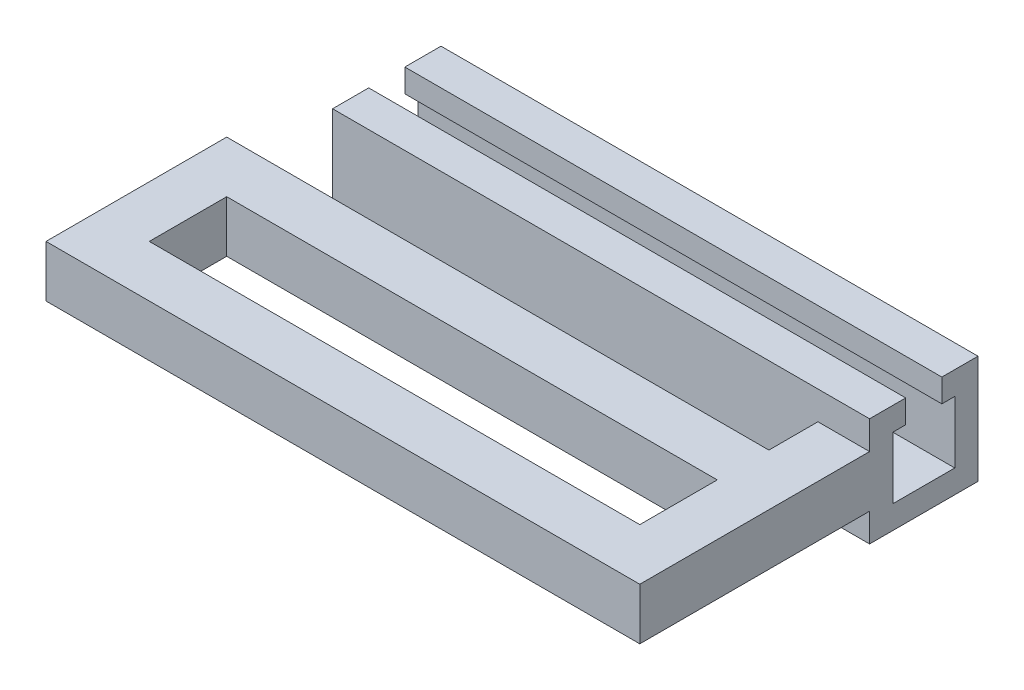
ISO-10303-21;
HEADER;
FILE_DESCRIPTION(('STEP AP214'),'2;1');
FILE_NAME('part.step','',(''),(''),'','','');
FILE_SCHEMA(('AUTOMOTIVE_DESIGN { 1 0 10303 214 1 1 1 1 }'));
ENDSEC;
DATA;
#1=APPLICATION_CONTEXT('core data for automotive mechanical design processes');
#2=APPLICATION_PROTOCOL_DEFINITION('international standard','automotive_design',2000,#1);
#3=PRODUCT_CONTEXT('',#1,'mechanical');
#4=PRODUCT('Part','Part','',(#3));
#5=PRODUCT_RELATED_PRODUCT_CATEGORY('part','',(#4));
#6=PRODUCT_DEFINITION_FORMATION('','',#4);
#7=PRODUCT_DEFINITION_CONTEXT('part definition',#1,'design');
#8=PRODUCT_DEFINITION('design','',#6,#7);
#9=PRODUCT_DEFINITION_SHAPE('','',#8);
#10=(LENGTH_UNIT() NAMED_UNIT(*) SI_UNIT(.MILLI.,.METRE.));
#11=(NAMED_UNIT(*) PLANE_ANGLE_UNIT() SI_UNIT($,.RADIAN.));
#12=(NAMED_UNIT(*) SI_UNIT($,.STERADIAN.) SOLID_ANGLE_UNIT());
#13=UNCERTAINTY_MEASURE_WITH_UNIT(LENGTH_MEASURE(1.E-05),#10,'distance_accuracy_value','');
#14=(GEOMETRIC_REPRESENTATION_CONTEXT(3) GLOBAL_UNCERTAINTY_ASSIGNED_CONTEXT((#13)) GLOBAL_UNIT_ASSIGNED_CONTEXT((#10,
#11,#12)) REPRESENTATION_CONTEXT('',''));
#15=CARTESIAN_POINT('',(0.,0.,0.));
#16=DIRECTION('',(0.,0.,1.));
#17=DIRECTION('',(1.,0.,0.));
#18=AXIS2_PLACEMENT_3D('',#15,#16,#17);
#19=CARTESIAN_POINT('',(12.5205254515599,3.1,-12.475));
#20=DIRECTION('',(0.,1.,0.));
#21=DIRECTION('',(0.,0.,1.));
#22=AXIS2_PLACEMENT_3D('',#19,#20,#21);
#23=PLANE('',#22);
#24=DIRECTION('',(-1.,0.,0.));
#25=VECTOR('',#24,1.);
#26=CARTESIAN_POINT('',(12.5205254515599,3.1,-11.075));
#27=LINE('',#26,#25);
#28=CARTESIAN_POINT('',(12.5205254515599,3.1,-11.075));
#29=VERTEX_POINT('',#28);
#30=CARTESIAN_POINT('',(-8.27947454844007,3.1,-11.075));
#31=VERTEX_POINT('',#30);
#32=EDGE_CURVE('E200',#29,#31,#27,.T.);
#33=ORIENTED_EDGE('',*,*,#32,.F.);
#34=DIRECTION('',(0.,0.,-1.));
#35=VECTOR('',#34,1.);
#36=CARTESIAN_POINT('',(12.5205254515599,3.1,-12.475));
#37=LINE('',#36,#35);
#38=CARTESIAN_POINT('',(12.5205254515599,3.1,-12.475));
#39=VERTEX_POINT('',#38);
#40=EDGE_CURVE('E259',#29,#39,#37,.T.);
#41=ORIENTED_EDGE('',*,*,#40,.T.);
#42=DIRECTION('',(-1.,0.,0.));
#43=VECTOR('',#42,1.);
#44=CARTESIAN_POINT('',(12.5205254515599,3.1,-12.475));
#45=LINE('',#44,#43);
#46=CARTESIAN_POINT('',(-8.27947454844007,3.1,-12.475));
#47=VERTEX_POINT('',#46);
#48=EDGE_CURVE('E277',#39,#47,#45,.T.);
#49=ORIENTED_EDGE('',*,*,#48,.T.);
#50=DIRECTION('',(0.,0.,-1.));
#51=VECTOR('',#50,1.);
#52=CARTESIAN_POINT('',(-8.27947454844007,3.1,-12.475));
#53=LINE('',#52,#51);
#54=EDGE_CURVE('E247',#31,#47,#53,.T.);
#55=ORIENTED_EDGE('',*,*,#54,.F.);
#56=EDGE_LOOP('',(#33,#41,#49,#55));
#57=FACE_BOUND('',#56,.T.);
#58=ADVANCED_FACE('F33',(#57),#23,.T.);
#59=CARTESIAN_POINT('',(0.,2.,0.));
#60=DIRECTION('',(0.,1.,0.));
#61=DIRECTION('',(0.,0.,1.));
#62=AXIS2_PLACEMENT_3D('',#59,#60,#61);
#63=PLANE('',#62);
#64=DIRECTION('',(1.,0.,0.));
#65=VECTOR('',#64,1.);
#66=CARTESIAN_POINT('',(0.,2.,-8.275));
#67=LINE('',#66,#65);
#68=CARTESIAN_POINT('',(10.5205254515599,2.,-8.275));
#69=VERTEX_POINT('',#68);
#70=CARTESIAN_POINT('',(12.5205254515599,2.,-8.275));
#71=VERTEX_POINT('',#70);
#72=EDGE_CURVE('E285',#69,#71,#67,.T.);
#73=ORIENTED_EDGE('',*,*,#72,.F.);
#74=DIRECTION('',(0.,0.,1.));
#75=VECTOR('',#74,1.);
#76=CARTESIAN_POINT('',(10.5205254515599,2.,-9.375));
#77=LINE('',#76,#75);
#78=CARTESIAN_POINT('',(10.5205254515599,2.,-6.375));
#79=VERTEX_POINT('',#78);
#80=EDGE_CURVE('E320',#69,#79,#77,.T.);
#81=ORIENTED_EDGE('',*,*,#80,.T.);
#82=DIRECTION('',(-1.,0.,0.));
#83=VECTOR('',#82,1.);
#84=CARTESIAN_POINT('',(-10.4794745484401,2.,-6.375));
#85=LINE('',#84,#83);
#86=CARTESIAN_POINT('',(-10.4794745484401,2.,-6.375));
#87=VERTEX_POINT('',#86);
#88=EDGE_CURVE('E322',#79,#87,#85,.T.);
#89=ORIENTED_EDGE('',*,*,#88,.T.);
#90=DIRECTION('',(0.,0.,1.));
#91=VECTOR('',#90,1.);
#92=CARTESIAN_POINT('',(-10.4794745484401,2.,-6.375));
#93=LINE('',#92,#91);
#94=CARTESIAN_POINT('',(-10.4794745484401,2.,0.625000000000001));
#95=VERTEX_POINT('',#94);
#96=EDGE_CURVE('E325',#87,#95,#93,.T.);
#97=ORIENTED_EDGE('',*,*,#96,.T.);
#98=DIRECTION('',(1.,0.,0.));
#99=VECTOR('',#98,1.);
#100=CARTESIAN_POINT('',(10.5205254515599,2.,0.625000000000001));
#101=LINE('',#100,#99);
#102=CARTESIAN_POINT('',(12.5205254515599,2.,0.625));
#103=VERTEX_POINT('',#102);
#104=EDGE_CURVE('E327',#95,#103,#101,.T.);
#105=ORIENTED_EDGE('',*,*,#104,.T.);
#106=DIRECTION('',(0.,0.,-1.));
#107=VECTOR('',#106,1.);
#108=CARTESIAN_POINT('',(12.5205254515599,2.,-11.375));
#109=LINE('',#108,#107);
#110=EDGE_CURVE('E329',#103,#71,#109,.T.);
#111=ORIENTED_EDGE('',*,*,#110,.T.);
#112=EDGE_LOOP('',(#73,#81,#89,#97,#105,#111));
#113=FACE_BOUND('',#112,.T.);
#114=DIRECTION('',(-1.,0.,0.));
#115=VECTOR('',#114,1.);
#116=CARTESIAN_POINT('',(-8.47947454844007,2.,-4.375));
#117=LINE('',#116,#115);
#118=CARTESIAN_POINT('',(10.5205254515599,2.,-4.375));
#119=VERTEX_POINT('',#118);
#120=CARTESIAN_POINT('',(-8.47947454844007,2.,-4.375));
#121=VERTEX_POINT('',#120);
#122=EDGE_CURVE('E291',#119,#121,#117,.T.);
#123=ORIENTED_EDGE('',*,*,#122,.F.);
#124=DIRECTION('',(0.,0.,-1.));
#125=VECTOR('',#124,1.);
#126=CARTESIAN_POINT('',(10.5205254515599,2.,-4.375));
#127=LINE('',#126,#125);
#128=CARTESIAN_POINT('',(10.5205254515599,2.,-1.375));
#129=VERTEX_POINT('',#128);
#130=EDGE_CURVE('E289',#129,#119,#127,.T.);
#131=ORIENTED_EDGE('',*,*,#130,.F.);
#132=DIRECTION('',(1.,0.,0.));
#133=VECTOR('',#132,1.);
#134=CARTESIAN_POINT('',(10.5205254515599,2.,-1.375));
#135=LINE('',#134,#133);
#136=CARTESIAN_POINT('',(-8.47947454844007,2.,-1.375));
#137=VERTEX_POINT('',#136);
#138=EDGE_CURVE('E297',#137,#129,#135,.T.);
#139=ORIENTED_EDGE('',*,*,#138,.F.);
#140=DIRECTION('',(0.,0.,1.));
#141=VECTOR('',#140,1.);
#142=CARTESIAN_POINT('',(-8.47947454844007,2.,-4.375));
#143=LINE('',#142,#141);
#144=EDGE_CURVE('E294',#121,#137,#143,.T.);
#145=ORIENTED_EDGE('',*,*,#144,.F.);
#146=EDGE_LOOP('',(#123,#131,#139,#145));
#147=FACE_BOUND('',#146,.T.);
#148=ADVANCED_FACE('F374',(#113,#147),#63,.T.);
#149=CARTESIAN_POINT('',(0.,0.,0.));
#150=DIRECTION('',(0.,1.,0.));
#151=DIRECTION('',(0.,0.,1.));
#152=AXIS2_PLACEMENT_3D('',#149,#150,#151);
#153=PLANE('',#152);
#154=DIRECTION('',(0.,0.,-1.));
#155=VECTOR('',#154,1.);
#156=CARTESIAN_POINT('',(10.5205254515599,0.,-4.375));
#157=LINE('',#156,#155);
#158=CARTESIAN_POINT('',(10.5205254515599,0.,-1.375));
#159=VERTEX_POINT('',#158);
#160=CARTESIAN_POINT('',(10.5205254515599,0.,-4.375));
#161=VERTEX_POINT('',#160);
#162=EDGE_CURVE('E288',#159,#161,#157,.T.);
#163=ORIENTED_EDGE('',*,*,#162,.T.);
#164=DIRECTION('',(-1.,0.,0.));
#165=VECTOR('',#164,1.);
#166=CARTESIAN_POINT('',(-8.47947454844007,0.,-4.375));
#167=LINE('',#166,#165);
#168=CARTESIAN_POINT('',(-8.47947454844007,0.,-4.375));
#169=VERTEX_POINT('',#168);
#170=EDGE_CURVE('E302',#161,#169,#167,.T.);
#171=ORIENTED_EDGE('',*,*,#170,.T.);
#172=DIRECTION('',(0.,0.,1.));
#173=VECTOR('',#172,1.);
#174=CARTESIAN_POINT('',(-8.47947454844007,0.,-4.375));
#175=LINE('',#174,#173);
#176=CARTESIAN_POINT('',(-8.47947454844007,0.,-1.375));
#177=VERTEX_POINT('',#176);
#178=EDGE_CURVE('E305',#169,#177,#175,.T.);
#179=ORIENTED_EDGE('',*,*,#178,.T.);
#180=DIRECTION('',(1.,0.,0.));
#181=VECTOR('',#180,1.);
#182=CARTESIAN_POINT('',(10.5205254515599,0.,-1.375));
#183=LINE('',#182,#181);
#184=EDGE_CURVE('E292',#177,#159,#183,.T.);
#185=ORIENTED_EDGE('',*,*,#184,.T.);
#186=EDGE_LOOP('',(#163,#171,#179,#185));
#187=FACE_BOUND('',#186,.T.);
#188=DIRECTION('',(0.,0.,1.));
#189=VECTOR('',#188,1.);
#190=CARTESIAN_POINT('',(10.5205254515599,0.,-9.375));
#191=LINE('',#190,#189);
#192=CARTESIAN_POINT('',(10.5205254515599,0.,-8.275));
#193=VERTEX_POINT('',#192);
#194=CARTESIAN_POINT('',(10.5205254515599,0.,-6.375));
#195=VERTEX_POINT('',#194);
#196=EDGE_CURVE('E319',#193,#195,#191,.T.);
#197=ORIENTED_EDGE('',*,*,#196,.F.);
#198=DIRECTION('',(1.,0.,0.));
#199=VECTOR('',#198,1.);
#200=CARTESIAN_POINT('',(0.,0.,-8.275));
#201=LINE('',#200,#199);
#202=CARTESIAN_POINT('',(12.5205254515599,0.,-8.275));
#203=VERTEX_POINT('',#202);
#204=EDGE_CURVE('E283',#193,#203,#201,.T.);
#205=ORIENTED_EDGE('',*,*,#204,.T.);
#206=DIRECTION('',(0.,0.,-1.));
#207=VECTOR('',#206,1.);
#208=CARTESIAN_POINT('',(12.5205254515599,0.,-11.375));
#209=LINE('',#208,#207);
#210=CARTESIAN_POINT('',(12.5205254515599,0.,0.625));
#211=VERTEX_POINT('',#210);
#212=EDGE_CURVE('E323',#211,#203,#209,.T.);
#213=ORIENTED_EDGE('',*,*,#212,.F.);
#214=DIRECTION('',(1.,0.,0.));
#215=VECTOR('',#214,1.);
#216=CARTESIAN_POINT('',(12.5205254515599,0.,0.625));
#217=LINE('',#216,#215);
#218=CARTESIAN_POINT('',(-10.4794745484401,0.,0.625000000000001));
#219=VERTEX_POINT('',#218);
#220=EDGE_CURVE('E338',#219,#211,#217,.T.);
#221=ORIENTED_EDGE('',*,*,#220,.F.);
#222=DIRECTION('',(0.,0.,1.));
#223=VECTOR('',#222,1.);
#224=CARTESIAN_POINT('',(-10.4794745484401,0.,-6.375));
#225=LINE('',#224,#223);
#226=CARTESIAN_POINT('',(-10.4794745484401,0.,-6.375));
#227=VERTEX_POINT('',#226);
#228=EDGE_CURVE('E335',#227,#219,#225,.T.);
#229=ORIENTED_EDGE('',*,*,#228,.F.);
#230=DIRECTION('',(-1.,0.,0.));
#231=VECTOR('',#230,1.);
#232=CARTESIAN_POINT('',(-10.4794745484401,0.,-6.375));
#233=LINE('',#232,#231);
#234=EDGE_CURVE('E333',#195,#227,#233,.T.);
#235=ORIENTED_EDGE('',*,*,#234,.F.);
#236=EDGE_LOOP('',(#197,#205,#213,#221,#229,#235));
#237=FACE_BOUND('',#236,.T.);
#238=ADVANCED_FACE('F361',(#187,#237),#153,.F.);
#239=CARTESIAN_POINT('',(10.5205254515599,2.,-9.375));
#240=DIRECTION('',(1.,0.,0.));
#241=DIRECTION('',(0.,0.,-1.));
#242=AXIS2_PLACEMENT_3D('',#239,#240,#241);
#243=PLANE('',#242);
#244=ORIENTED_EDGE('',*,*,#80,.F.);
#245=DIRECTION('',(0.,-1.,0.));
#246=VECTOR('',#245,1.);
#247=CARTESIAN_POINT('',(10.5205254515599,2.,-8.275));
#248=LINE('',#247,#246);
#249=EDGE_CURVE('E273',#69,#193,#248,.T.);
#250=ORIENTED_EDGE('',*,*,#249,.T.);
#251=ORIENTED_EDGE('',*,*,#196,.T.);
#252=DIRECTION('',(0.,-1.,0.));
#253=VECTOR('',#252,1.);
#254=CARTESIAN_POINT('',(10.5205254515599,2.,-6.375));
#255=LINE('',#254,#253);
#256=EDGE_CURVE('E41',#79,#195,#255,.T.);
#257=ORIENTED_EDGE('',*,*,#256,.F.);
#258=EDGE_LOOP('',(#244,#250,#251,#257));
#259=FACE_BOUND('',#258,.T.);
#260=ADVANCED_FACE('F35',(#259),#243,.F.);
#261=CARTESIAN_POINT('',(-10.4794745484401,2.,-6.375));
#262=DIRECTION('',(0.,0.,1.));
#263=DIRECTION('',(1.,0.,0.));
#264=AXIS2_PLACEMENT_3D('',#261,#262,#263);
#265=PLANE('',#264);
#266=ORIENTED_EDGE('',*,*,#234,.T.);
#267=DIRECTION('',(0.,-1.,0.));
#268=VECTOR('',#267,1.);
#269=CARTESIAN_POINT('',(-10.4794745484401,2.,-6.375));
#270=LINE('',#269,#268);
#271=EDGE_CURVE('E347',#87,#227,#270,.T.);
#272=ORIENTED_EDGE('',*,*,#271,.F.);
#273=ORIENTED_EDGE('',*,*,#88,.F.);
#274=ORIENTED_EDGE('',*,*,#256,.T.);
#275=EDGE_LOOP('',(#266,#272,#273,#274));
#276=FACE_BOUND('',#275,.T.);
#277=ADVANCED_FACE('F354',(#276),#265,.F.);
#278=CARTESIAN_POINT('',(-10.4794745484401,2.,-6.375));
#279=DIRECTION('',(1.,0.,0.));
#280=DIRECTION('',(0.,0.,-1.));
#281=AXIS2_PLACEMENT_3D('',#278,#279,#280);
#282=PLANE('',#281);
#283=ORIENTED_EDGE('',*,*,#228,.T.);
#284=DIRECTION('',(0.,-1.,0.));
#285=VECTOR('',#284,1.);
#286=CARTESIAN_POINT('',(-10.4794745484401,2.,0.625000000000001));
#287=LINE('',#286,#285);
#288=EDGE_CURVE('E344',#95,#219,#287,.T.);
#289=ORIENTED_EDGE('',*,*,#288,.F.);
#290=ORIENTED_EDGE('',*,*,#96,.F.);
#291=ORIENTED_EDGE('',*,*,#271,.T.);
#292=EDGE_LOOP('',(#283,#289,#290,#291));
#293=FACE_BOUND('',#292,.T.);
#294=ADVANCED_FACE('F366',(#293),#282,.F.);
#295=CARTESIAN_POINT('',(12.5205254515599,2.,0.625));
#296=DIRECTION('',(0.,0.,-1.));
#297=DIRECTION('',(-1.,0.,0.));
#298=AXIS2_PLACEMENT_3D('',#295,#296,#297);
#299=PLANE('',#298);
#300=ORIENTED_EDGE('',*,*,#220,.T.);
#301=DIRECTION('',(0.,-1.,0.));
#302=VECTOR('',#301,1.);
#303=CARTESIAN_POINT('',(12.5205254515599,2.,0.625));
#304=LINE('',#303,#302);
#305=EDGE_CURVE('E331',#103,#211,#304,.T.);
#306=ORIENTED_EDGE('',*,*,#305,.F.);
#307=ORIENTED_EDGE('',*,*,#104,.F.);
#308=ORIENTED_EDGE('',*,*,#288,.T.);
#309=EDGE_LOOP('',(#300,#306,#307,#308));
#310=FACE_BOUND('',#309,.T.);
#311=ADVANCED_FACE('F370',(#310),#299,.F.);
#312=CARTESIAN_POINT('',(12.5205254515599,2.,-11.375));
#313=DIRECTION('',(-1.,0.,0.));
#314=DIRECTION('',(0.,0.,1.));
#315=AXIS2_PLACEMENT_3D('',#312,#313,#314);
#316=PLANE('',#315);
#317=ORIENTED_EDGE('',*,*,#40,.F.);
#318=DIRECTION('',(0.,-1.,0.));
#319=VECTOR('',#318,1.);
#320=CARTESIAN_POINT('',(12.5205254515599,2.,-11.075));
#321=LINE('',#320,#319);
#322=CARTESIAN_POINT('',(12.5205254515599,2.2,-11.075));
#323=VERTEX_POINT('',#322);
#324=EDGE_CURVE('E232',#29,#323,#321,.T.);
#325=ORIENTED_EDGE('',*,*,#324,.T.);
#326=DIRECTION('',(0.,0.,-1.));
#327=VECTOR('',#326,1.);
#328=CARTESIAN_POINT('',(12.5205254515599,2.2,-11.375));
#329=LINE('',#328,#327);
#330=CARTESIAN_POINT('',(12.5205254515599,2.2,-11.575));
#331=VERTEX_POINT('',#330);
#332=EDGE_CURVE('E192',#323,#331,#329,.T.);
#333=ORIENTED_EDGE('',*,*,#332,.T.);
#334=DIRECTION('',(0.,-1.,0.));
#335=VECTOR('',#334,1.);
#336=CARTESIAN_POINT('',(12.5205254515599,2.,-11.575));
#337=LINE('',#336,#335);
#338=CARTESIAN_POINT('',(12.5205254515599,-0.2,-11.575));
#339=VERTEX_POINT('',#338);
#340=EDGE_CURVE('E235',#331,#339,#337,.T.);
#341=ORIENTED_EDGE('',*,*,#340,.T.);
#342=DIRECTION('',(0.,0.,1.));
#343=VECTOR('',#342,1.);
#344=CARTESIAN_POINT('',(12.5205254515599,-0.200000000000001,-11.375));
#345=LINE('',#344,#343);
#346=CARTESIAN_POINT('',(12.5205254515599,-0.2,-9.175));
#347=VERTEX_POINT('',#346);
#348=EDGE_CURVE('E238',#339,#347,#345,.T.);
#349=ORIENTED_EDGE('',*,*,#348,.T.);
#350=DIRECTION('',(0.,1.,0.));
#351=VECTOR('',#350,1.);
#352=CARTESIAN_POINT('',(12.5205254515599,2.,-9.175));
#353=LINE('',#352,#351);
#354=CARTESIAN_POINT('',(12.5205254515599,2.2,-9.175));
#355=VERTEX_POINT('',#354);
#356=EDGE_CURVE('E241',#347,#355,#353,.T.);
#357=ORIENTED_EDGE('',*,*,#356,.T.);
#358=DIRECTION('',(0.,0.,-1.));
#359=VECTOR('',#358,1.);
#360=CARTESIAN_POINT('',(12.5205254515599,2.2,-11.375));
#361=LINE('',#360,#359);
#362=CARTESIAN_POINT('',(12.5205254515599,2.2,-9.675));
#363=VERTEX_POINT('',#362);
#364=EDGE_CURVE('E244',#355,#363,#361,.T.);
#365=ORIENTED_EDGE('',*,*,#364,.T.);
#366=DIRECTION('',(0.,1.,0.));
#367=VECTOR('',#366,1.);
#368=CARTESIAN_POINT('',(12.5205254515599,2.,-9.675));
#369=LINE('',#368,#367);
#370=CARTESIAN_POINT('',(12.5205254515599,3.1,-9.675));
#371=VERTEX_POINT('',#370);
#372=EDGE_CURVE('E228',#363,#371,#369,.T.);
#373=ORIENTED_EDGE('',*,*,#372,.T.);
#374=CARTESIAN_POINT('',(12.5205254515599,3.1,-8.275));
#375=VERTEX_POINT('',#374);
#376=EDGE_CURVE('E260',#375,#371,#37,.T.);
#377=ORIENTED_EDGE('',*,*,#376,.F.);
#378=DIRECTION('',(0.,1.,0.));
#379=VECTOR('',#378,1.);
#380=CARTESIAN_POINT('',(12.5205254515599,-1.1,-8.275));
#381=LINE('',#380,#379);
#382=EDGE_CURVE('E255',#71,#375,#381,.T.);
#383=ORIENTED_EDGE('',*,*,#382,.F.);
#384=ORIENTED_EDGE('',*,*,#110,.F.);
#385=ORIENTED_EDGE('',*,*,#305,.T.);
#386=ORIENTED_EDGE('',*,*,#212,.T.);
#387=CARTESIAN_POINT('',(12.5205254515599,-1.1,-8.275));
#388=VERTEX_POINT('',#387);
#389=EDGE_CURVE('E256',#388,#203,#381,.T.);
#390=ORIENTED_EDGE('',*,*,#389,.F.);
#391=DIRECTION('',(0.,0.,1.));
#392=VECTOR('',#391,1.);
#393=CARTESIAN_POINT('',(12.5205254515599,-1.1,-12.475));
#394=LINE('',#393,#392);
#395=CARTESIAN_POINT('',(12.5205254515599,-1.1,-12.475));
#396=VERTEX_POINT('',#395);
#397=EDGE_CURVE('E266',#396,#388,#394,.T.);
#398=ORIENTED_EDGE('',*,*,#397,.F.);
#399=DIRECTION('',(0.,-1.,0.));
#400=VECTOR('',#399,1.);
#401=CARTESIAN_POINT('',(12.5205254515599,-1.1,-12.475));
#402=LINE('',#401,#400);
#403=EDGE_CURVE('E263',#39,#396,#402,.T.);
#404=ORIENTED_EDGE('',*,*,#403,.F.);
#405=EDGE_LOOP('',(#317,#325,#333,#341,#349,#357,#365,#373,#377,#383,#384,#385,#386,#390,#398,#404));
#406=FACE_BOUND('',#405,.T.);
#407=ADVANCED_FACE('F383',(#406),#316,.F.);
#408=CARTESIAN_POINT('',(10.5205254515599,2.,-4.375));
#409=DIRECTION('',(-1.,0.,0.));
#410=DIRECTION('',(0.,0.,1.));
#411=AXIS2_PLACEMENT_3D('',#408,#409,#410);
#412=PLANE('',#411);
#413=ORIENTED_EDGE('',*,*,#162,.F.);
#414=DIRECTION('',(0.,-1.,0.));
#415=VECTOR('',#414,1.);
#416=CARTESIAN_POINT('',(10.5205254515599,2.,-1.375));
#417=LINE('',#416,#415);
#418=EDGE_CURVE('E299',#129,#159,#417,.T.);
#419=ORIENTED_EDGE('',*,*,#418,.F.);
#420=ORIENTED_EDGE('',*,*,#130,.T.);
#421=DIRECTION('',(0.,-1.,0.));
#422=VECTOR('',#421,1.);
#423=CARTESIAN_POINT('',(10.5205254515599,2.,-4.375));
#424=LINE('',#423,#422);
#425=EDGE_CURVE('E316',#119,#161,#424,.T.);
#426=ORIENTED_EDGE('',*,*,#425,.T.);
#427=EDGE_LOOP('',(#413,#419,#420,#426));
#428=FACE_BOUND('',#427,.T.);
#429=ADVANCED_FACE('F525',(#428),#412,.T.);
#430=CARTESIAN_POINT('',(-8.47947454844007,2.,-4.375));
#431=DIRECTION('',(0.,0.,1.));
#432=DIRECTION('',(1.,0.,0.));
#433=AXIS2_PLACEMENT_3D('',#430,#431,#432);
#434=PLANE('',#433);
#435=ORIENTED_EDGE('',*,*,#170,.F.);
#436=ORIENTED_EDGE('',*,*,#425,.F.);
#437=ORIENTED_EDGE('',*,*,#122,.T.);
#438=DIRECTION('',(0.,-1.,0.));
#439=VECTOR('',#438,1.);
#440=CARTESIAN_POINT('',(-8.47947454844007,2.,-4.375));
#441=LINE('',#440,#439);
#442=EDGE_CURVE('E314',#121,#169,#441,.T.);
#443=ORIENTED_EDGE('',*,*,#442,.T.);
#444=EDGE_LOOP('',(#435,#436,#437,#443));
#445=FACE_BOUND('',#444,.T.);
#446=ADVANCED_FACE('F561',(#445),#434,.T.);
#447=CARTESIAN_POINT('',(-8.47947454844007,2.,-4.375));
#448=DIRECTION('',(1.,0.,0.));
#449=DIRECTION('',(0.,0.,-1.));
#450=AXIS2_PLACEMENT_3D('',#447,#448,#449);
#451=PLANE('',#450);
#452=ORIENTED_EDGE('',*,*,#178,.F.);
#453=ORIENTED_EDGE('',*,*,#442,.F.);
#454=ORIENTED_EDGE('',*,*,#144,.T.);
#455=DIRECTION('',(0.,-1.,0.));
#456=VECTOR('',#455,1.);
#457=CARTESIAN_POINT('',(-8.47947454844007,2.,-1.375));
#458=LINE('',#457,#456);
#459=EDGE_CURVE('E312',#137,#177,#458,.T.);
#460=ORIENTED_EDGE('',*,*,#459,.T.);
#461=EDGE_LOOP('',(#452,#453,#454,#460));
#462=FACE_BOUND('',#461,.T.);
#463=ADVANCED_FACE('F552',(#462),#451,.T.);
#464=CARTESIAN_POINT('',(10.5205254515599,2.,-1.375));
#465=DIRECTION('',(0.,0.,-1.));
#466=DIRECTION('',(-1.,0.,0.));
#467=AXIS2_PLACEMENT_3D('',#464,#465,#466);
#468=PLANE('',#467);
#469=ORIENTED_EDGE('',*,*,#184,.F.);
#470=ORIENTED_EDGE('',*,*,#459,.F.);
#471=ORIENTED_EDGE('',*,*,#138,.T.);
#472=ORIENTED_EDGE('',*,*,#418,.T.);
#473=EDGE_LOOP('',(#469,#470,#471,#472));
#474=FACE_BOUND('',#473,.T.);
#475=ADVANCED_FACE('F420',(#474),#468,.T.);
#476=CARTESIAN_POINT('',(12.5205254515599,-1.1,-8.275));
#477=DIRECTION('',(0.,0.,1.));
#478=DIRECTION('',(1.,0.,0.));
#479=AXIS2_PLACEMENT_3D('',#476,#477,#478);
#480=PLANE('',#479);
#481=DIRECTION('',(0.,1.,0.));
#482=VECTOR('',#481,1.);
#483=CARTESIAN_POINT('',(-8.27947454844007,-1.1,-8.275));
#484=LINE('',#483,#482);
#485=CARTESIAN_POINT('',(-8.27947454844007,-1.1,-8.275));
#486=VERTEX_POINT('',#485);
#487=CARTESIAN_POINT('',(-8.27947454844006,3.1,-8.275));
#488=VERTEX_POINT('',#487);
#489=EDGE_CURVE('E56',#486,#488,#484,.T.);
#490=ORIENTED_EDGE('',*,*,#489,.F.);
#491=DIRECTION('',(-1.,0.,0.));
#492=VECTOR('',#491,1.);
#493=CARTESIAN_POINT('',(12.5205254515599,-1.1,-8.275));
#494=LINE('',#493,#492);
#495=EDGE_CURVE('E270',#388,#486,#494,.T.);
#496=ORIENTED_EDGE('',*,*,#495,.F.);
#497=ORIENTED_EDGE('',*,*,#389,.T.);
#498=ORIENTED_EDGE('',*,*,#204,.F.);
#499=ORIENTED_EDGE('',*,*,#249,.F.);
#500=ORIENTED_EDGE('',*,*,#72,.T.);
#501=ORIENTED_EDGE('',*,*,#382,.T.);
#502=DIRECTION('',(-1.,0.,0.));
#503=VECTOR('',#502,1.);
#504=CARTESIAN_POINT('',(12.5205254515599,3.1,-8.275));
#505=LINE('',#504,#503);
#506=EDGE_CURVE('E269',#375,#488,#505,.T.);
#507=ORIENTED_EDGE('',*,*,#506,.T.);
#508=EDGE_LOOP('',(#490,#496,#497,#498,#499,#500,#501,#507));
#509=FACE_BOUND('',#508,.T.);
#510=ADVANCED_FACE('F378',(#509),#480,.T.);
#511=CARTESIAN_POINT('',(12.5205254515599,-1.1,-12.475));
#512=DIRECTION('',(0.,-1.,0.));
#513=DIRECTION('',(0.,0.,-1.));
#514=AXIS2_PLACEMENT_3D('',#511,#512,#513);
#515=PLANE('',#514);
#516=DIRECTION('',(0.,0.,1.));
#517=VECTOR('',#516,1.);
#518=CARTESIAN_POINT('',(-8.27947454844007,-1.1,-12.475));
#519=LINE('',#518,#517);
#520=CARTESIAN_POINT('',(-8.27947454844007,-1.1,-12.475));
#521=VERTEX_POINT('',#520);
#522=EDGE_CURVE('E252',#521,#486,#519,.T.);
#523=ORIENTED_EDGE('',*,*,#522,.F.);
#524=DIRECTION('',(-1.,0.,0.));
#525=VECTOR('',#524,1.);
#526=CARTESIAN_POINT('',(12.5205254515599,-1.1,-12.475));
#527=LINE('',#526,#525);
#528=EDGE_CURVE('E274',#396,#521,#527,.T.);
#529=ORIENTED_EDGE('',*,*,#528,.F.);
#530=ORIENTED_EDGE('',*,*,#397,.T.);
#531=ORIENTED_EDGE('',*,*,#495,.T.);
#532=EDGE_LOOP('',(#523,#529,#530,#531));
#533=FACE_BOUND('',#532,.T.);
#534=ADVANCED_FACE('F412',(#533),#515,.T.);
#535=CARTESIAN_POINT('',(12.5205254515599,-1.1,-12.475));
#536=DIRECTION('',(0.,0.,-1.));
#537=DIRECTION('',(-1.,0.,0.));
#538=AXIS2_PLACEMENT_3D('',#535,#536,#537);
#539=PLANE('',#538);
#540=DIRECTION('',(0.,-1.,0.));
#541=VECTOR('',#540,1.);
#542=CARTESIAN_POINT('',(-8.27947454844007,-1.1,-12.475));
#543=LINE('',#542,#541);
#544=EDGE_CURVE('E250',#47,#521,#543,.T.);
#545=ORIENTED_EDGE('',*,*,#544,.F.);
#546=ORIENTED_EDGE('',*,*,#48,.F.);
#547=ORIENTED_EDGE('',*,*,#403,.T.);
#548=ORIENTED_EDGE('',*,*,#528,.T.);
#549=EDGE_LOOP('',(#545,#546,#547,#548));
#550=FACE_BOUND('',#549,.T.);
#551=ADVANCED_FACE('F410',(#550),#539,.T.);
#552=DIRECTION('',(1.,0.,0.));
#553=VECTOR('',#552,1.);
#554=CARTESIAN_POINT('',(12.5205254515599,3.1,-9.675));
#555=LINE('',#554,#553);
#556=CARTESIAN_POINT('',(-8.27947454844007,3.1,-9.675));
#557=VERTEX_POINT('',#556);
#558=EDGE_CURVE('E220',#557,#371,#555,.T.);
#559=ORIENTED_EDGE('',*,*,#558,.F.);
#560=EDGE_CURVE('E248',#488,#557,#53,.T.);
#561=ORIENTED_EDGE('',*,*,#560,.F.);
#562=ORIENTED_EDGE('',*,*,#506,.F.);
#563=ORIENTED_EDGE('',*,*,#376,.T.);
#564=EDGE_LOOP('',(#559,#561,#562,#563));
#565=FACE_BOUND('',#564,.T.);
#566=ADVANCED_FACE('F389',(#565),#23,.T.);
#567=CARTESIAN_POINT('',(-8.27947454844007,-4.5,-18.6753537379678));
#568=DIRECTION('',(1.,0.,0.));
#569=DIRECTION('',(0.,0.,-1.));
#570=AXIS2_PLACEMENT_3D('',#567,#568,#569);
#571=PLANE('',#570);
#572=DIRECTION('',(0.,0.,-1.));
#573=VECTOR('',#572,1.);
#574=CARTESIAN_POINT('',(-8.27947454844007,2.2,-11.575));
#575=LINE('',#574,#573);
#576=CARTESIAN_POINT('',(-8.27947454844007,2.2,-11.075));
#577=VERTEX_POINT('',#576);
#578=CARTESIAN_POINT('',(-8.27947454844007,2.2,-11.575));
#579=VERTEX_POINT('',#578);
#580=EDGE_CURVE('E189',#577,#579,#575,.T.);
#581=ORIENTED_EDGE('',*,*,#580,.F.);
#582=DIRECTION('',(0.,1.,0.));
#583=VECTOR('',#582,1.);
#584=CARTESIAN_POINT('',(-8.27947454844007,-4.5,-11.075));
#585=LINE('',#584,#583);
#586=EDGE_CURVE('E11',#577,#31,#585,.T.);
#587=ORIENTED_EDGE('',*,*,#586,.T.);
#588=ORIENTED_EDGE('',*,*,#54,.T.);
#589=ORIENTED_EDGE('',*,*,#544,.T.);
#590=ORIENTED_EDGE('',*,*,#522,.T.);
#591=ORIENTED_EDGE('',*,*,#489,.T.);
#592=ORIENTED_EDGE('',*,*,#560,.T.);
#593=DIRECTION('',(0.,1.,0.));
#594=VECTOR('',#593,1.);
#595=CARTESIAN_POINT('',(-8.27947454844007,2.2,-9.675));
#596=LINE('',#595,#594);
#597=CARTESIAN_POINT('',(-8.27947454844007,2.2,-9.675));
#598=VERTEX_POINT('',#597);
#599=EDGE_CURVE('E206',#598,#557,#596,.T.);
#600=ORIENTED_EDGE('',*,*,#599,.F.);
#601=DIRECTION('',(0.,0.,-1.));
#602=VECTOR('',#601,1.);
#603=CARTESIAN_POINT('',(-8.27947454844007,2.2,-9.675));
#604=LINE('',#603,#602);
#605=CARTESIAN_POINT('',(-8.27947454844007,2.2,-9.175));
#606=VERTEX_POINT('',#605);
#607=EDGE_CURVE('E48',#606,#598,#604,.T.);
#608=ORIENTED_EDGE('',*,*,#607,.F.);
#609=DIRECTION('',(0.,1.,0.));
#610=VECTOR('',#609,1.);
#611=CARTESIAN_POINT('',(-8.27947454844007,-0.2,-9.175));
#612=LINE('',#611,#610);
#613=CARTESIAN_POINT('',(-8.27947454844007,-0.2,-9.175));
#614=VERTEX_POINT('',#613);
#615=EDGE_CURVE('E215',#614,#606,#612,.T.);
#616=ORIENTED_EDGE('',*,*,#615,.F.);
#617=DIRECTION('',(0.,0.,1.));
#618=VECTOR('',#617,1.);
#619=CARTESIAN_POINT('',(-8.27947454844007,-0.2,-11.575));
#620=LINE('',#619,#618);
#621=CARTESIAN_POINT('',(-8.27947454844007,-0.2,-11.575));
#622=VERTEX_POINT('',#621);
#623=EDGE_CURVE('E208',#622,#614,#620,.T.);
#624=ORIENTED_EDGE('',*,*,#623,.F.);
#625=DIRECTION('',(0.,-1.,0.));
#626=VECTOR('',#625,1.);
#627=CARTESIAN_POINT('',(-8.27947454844007,-0.2,-11.575));
#628=LINE('',#627,#626);
#629=EDGE_CURVE('E205',#579,#622,#628,.T.);
#630=ORIENTED_EDGE('',*,*,#629,.F.);
#631=EDGE_LOOP('',(#581,#587,#588,#589,#590,#591,#592,#600,#608,#616,#624,#630));
#632=FACE_BOUND('',#631,.T.);
#633=ADVANCED_FACE('F202',(#632),#571,.F.);
#634=CARTESIAN_POINT('',(15.7205254515599,2.2,-9.675));
#635=DIRECTION('',(0.,1.,0.));
#636=DIRECTION('',(0.,0.,1.));
#637=AXIS2_PLACEMENT_3D('',#634,#635,#636);
#638=PLANE('',#637);
#639=DIRECTION('',(-1.,0.,0.));
#640=VECTOR('',#639,1.);
#641=CARTESIAN_POINT('',(15.7205254515599,2.2,-9.175));
#642=LINE('',#641,#640);
#643=EDGE_CURVE('E218',#355,#606,#642,.T.);
#644=ORIENTED_EDGE('',*,*,#643,.T.);
#645=ORIENTED_EDGE('',*,*,#607,.T.);
#646=DIRECTION('',(-1.,0.,0.));
#647=VECTOR('',#646,1.);
#648=CARTESIAN_POINT('',(15.7205254515599,2.2,-9.675));
#649=LINE('',#648,#647);
#650=EDGE_CURVE('E196',#363,#598,#649,.T.);
#651=ORIENTED_EDGE('',*,*,#650,.F.);
#652=ORIENTED_EDGE('',*,*,#364,.F.);
#653=EDGE_LOOP('',(#644,#645,#651,#652));
#654=FACE_BOUND('',#653,.T.);
#655=ADVANCED_FACE('F394',(#654),#638,.F.);
#656=CARTESIAN_POINT('',(15.7205254515599,-0.2,-9.175));
#657=DIRECTION('',(0.,0.,1.));
#658=DIRECTION('',(1.,0.,0.));
#659=AXIS2_PLACEMENT_3D('',#656,#657,#658);
#660=PLANE('',#659);
#661=DIRECTION('',(-1.,0.,0.));
#662=VECTOR('',#661,1.);
#663=CARTESIAN_POINT('',(15.7205254515599,-0.2,-9.175));
#664=LINE('',#663,#662);
#665=EDGE_CURVE('E221',#347,#614,#664,.T.);
#666=ORIENTED_EDGE('',*,*,#665,.T.);
#667=ORIENTED_EDGE('',*,*,#615,.T.);
#668=ORIENTED_EDGE('',*,*,#643,.F.);
#669=ORIENTED_EDGE('',*,*,#356,.F.);
#670=EDGE_LOOP('',(#666,#667,#668,#669));
#671=FACE_BOUND('',#670,.T.);
#672=ADVANCED_FACE('F398',(#671),#660,.F.);
#673=CARTESIAN_POINT('',(15.7205254515599,-0.2,-11.575));
#674=DIRECTION('',(0.,-1.,0.));
#675=DIRECTION('',(0.,0.,-1.));
#676=AXIS2_PLACEMENT_3D('',#673,#674,#675);
#677=PLANE('',#676);
#678=DIRECTION('',(-1.,0.,0.));
#679=VECTOR('',#678,1.);
#680=CARTESIAN_POINT('',(15.7205254515599,-0.2,-11.575));
#681=LINE('',#680,#679);
#682=EDGE_CURVE('E223',#339,#622,#681,.T.);
#683=ORIENTED_EDGE('',*,*,#682,.T.);
#684=ORIENTED_EDGE('',*,*,#623,.T.);
#685=ORIENTED_EDGE('',*,*,#665,.F.);
#686=ORIENTED_EDGE('',*,*,#348,.F.);
#687=EDGE_LOOP('',(#683,#684,#685,#686));
#688=FACE_BOUND('',#687,.T.);
#689=ADVANCED_FACE('F400',(#688),#677,.F.);
#690=CARTESIAN_POINT('',(15.7205254515599,-0.2,-11.575));
#691=DIRECTION('',(0.,0.,-1.));
#692=DIRECTION('',(-1.,0.,0.));
#693=AXIS2_PLACEMENT_3D('',#690,#691,#692);
#694=PLANE('',#693);
#695=DIRECTION('',(-1.,0.,0.));
#696=VECTOR('',#695,1.);
#697=CARTESIAN_POINT('',(15.7205254515599,2.2,-11.575));
#698=LINE('',#697,#696);
#699=EDGE_CURVE('E195',#331,#579,#698,.T.);
#700=ORIENTED_EDGE('',*,*,#699,.T.);
#701=ORIENTED_EDGE('',*,*,#629,.T.);
#702=ORIENTED_EDGE('',*,*,#682,.F.);
#703=ORIENTED_EDGE('',*,*,#340,.F.);
#704=EDGE_LOOP('',(#700,#701,#702,#703));
#705=FACE_BOUND('',#704,.T.);
#706=ADVANCED_FACE('F403',(#705),#694,.F.);
#707=CARTESIAN_POINT('',(15.7205254515599,2.2,-11.575));
#708=DIRECTION('',(0.,1.,0.));
#709=DIRECTION('',(0.,0.,1.));
#710=AXIS2_PLACEMENT_3D('',#707,#708,#709);
#711=PLANE('',#710);
#712=DIRECTION('',(-1.,0.,0.));
#713=VECTOR('',#712,1.);
#714=CARTESIAN_POINT('',(15.7205254515599,2.2,-11.075));
#715=LINE('',#714,#713);
#716=EDGE_CURVE('E184',#323,#577,#715,.T.);
#717=ORIENTED_EDGE('',*,*,#716,.T.);
#718=ORIENTED_EDGE('',*,*,#580,.T.);
#719=ORIENTED_EDGE('',*,*,#699,.F.);
#720=ORIENTED_EDGE('',*,*,#332,.F.);
#721=EDGE_LOOP('',(#717,#718,#719,#720));
#722=FACE_BOUND('',#721,.T.);
#723=ADVANCED_FACE('F186',(#722),#711,.F.);
#724=CARTESIAN_POINT('',(15.7205254515599,2.2,-11.075));
#725=DIRECTION('',(0.,0.,-1.));
#726=DIRECTION('',(-1.,0.,0.));
#727=AXIS2_PLACEMENT_3D('',#724,#725,#726);
#728=PLANE('',#727);
#729=ORIENTED_EDGE('',*,*,#32,.T.);
#730=ORIENTED_EDGE('',*,*,#586,.F.);
#731=ORIENTED_EDGE('',*,*,#716,.F.);
#732=ORIENTED_EDGE('',*,*,#324,.F.);
#733=EDGE_LOOP('',(#729,#730,#731,#732));
#734=FACE_BOUND('',#733,.T.);
#735=ADVANCED_FACE('F198',(#734),#728,.F.);
#736=CARTESIAN_POINT('',(15.7205254515599,2.2,-9.675));
#737=DIRECTION('',(0.,0.,1.));
#738=DIRECTION('',(1.,0.,0.));
#739=AXIS2_PLACEMENT_3D('',#736,#737,#738);
#740=PLANE('',#739);
#741=ORIENTED_EDGE('',*,*,#650,.T.);
#742=ORIENTED_EDGE('',*,*,#599,.T.);
#743=ORIENTED_EDGE('',*,*,#558,.T.);
#744=ORIENTED_EDGE('',*,*,#372,.F.);
#745=EDGE_LOOP('',(#741,#742,#743,#744));
#746=FACE_BOUND('',#745,.T.);
#747=ADVANCED_FACE('F393',(#746),#740,.F.);
#748=CLOSED_SHELL('',(#58,#148,#238,#260,#277,#294,#311,#407,#429,#446,#463,#475,#510,#534,#551,
#566,#633,#655,#672,#689,#706,#723,#735,#747));
#749=MANIFOLD_SOLID_BREP('B2',#748);
#750=ADVANCED_BREP_SHAPE_REPRESENTATION('',(#18,#749),#14);
#751=SHAPE_DEFINITION_REPRESENTATION(#9,#750);
ENDSEC;
END-ISO-10303-21;
